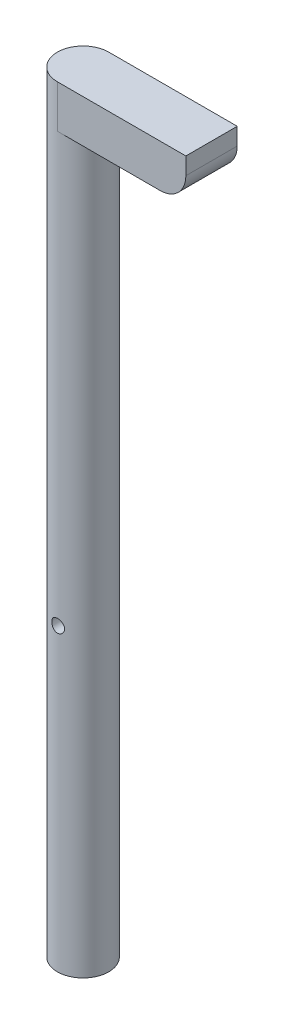
ISO-10303-21;
HEADER;
FILE_DESCRIPTION(('STEP AP214'),'2;1');
FILE_NAME('part.step','',(''),(''),'','','');
FILE_SCHEMA(('AUTOMOTIVE_DESIGN { 1 0 10303 214 1 1 1 1 }'));
ENDSEC;
DATA;
#1=APPLICATION_CONTEXT('core data for automotive mechanical design processes');
#2=APPLICATION_PROTOCOL_DEFINITION('international standard','automotive_design',2000,#1);
#3=PRODUCT_CONTEXT('',#1,'mechanical');
#4=PRODUCT('Part','Part','',(#3));
#5=PRODUCT_RELATED_PRODUCT_CATEGORY('part','',(#4));
#6=PRODUCT_DEFINITION_FORMATION('','',#4);
#7=PRODUCT_DEFINITION_CONTEXT('part definition',#1,'design');
#8=PRODUCT_DEFINITION('design','',#6,#7);
#9=PRODUCT_DEFINITION_SHAPE('','',#8);
#10=(LENGTH_UNIT() NAMED_UNIT(*) SI_UNIT(.MILLI.,.METRE.));
#11=(NAMED_UNIT(*) PLANE_ANGLE_UNIT() SI_UNIT($,.RADIAN.));
#12=(NAMED_UNIT(*) SI_UNIT($,.STERADIAN.) SOLID_ANGLE_UNIT());
#13=UNCERTAINTY_MEASURE_WITH_UNIT(LENGTH_MEASURE(1.E-05),#10,'distance_accuracy_value','');
#14=(GEOMETRIC_REPRESENTATION_CONTEXT(3) GLOBAL_UNCERTAINTY_ASSIGNED_CONTEXT((#13)) GLOBAL_UNIT_ASSIGNED_CONTEXT((#10,
#11,#12)) REPRESENTATION_CONTEXT('',''));
#15=CARTESIAN_POINT('',(0.,0.,0.));
#16=DIRECTION('',(0.,0.,1.));
#17=DIRECTION('',(1.,0.,0.));
#18=AXIS2_PLACEMENT_3D('',#15,#16,#17);
#19=CARTESIAN_POINT('',(12.,-2.,0.));
#20=DIRECTION('',(0.,0.,-1.));
#21=DIRECTION('',(-1.,0.,0.));
#22=AXIS2_PLACEMENT_3D('',#19,#20,#21);
#23=CYLINDRICAL_SURFACE('',#22,3.);
#24=DIRECTION('',(0.,0.,1.));
#25=VECTOR('',#24,1.);
#26=CARTESIAN_POINT('',(12.,-5.,0.));
#27=LINE('',#26,#25);
#28=CARTESIAN_POINT('',(12.,-5.,-3.));
#29=VERTEX_POINT('',#28);
#30=CARTESIAN_POINT('',(12.,-5.,3.));
#31=VERTEX_POINT('',#30);
#32=EDGE_CURVE('E100',#29,#31,#27,.T.);
#33=ORIENTED_EDGE('',*,*,#32,.F.);
#34=CARTESIAN_POINT('',(12.,-2.,-3.));
#35=DIRECTION('',(0.,0.,-1.));
#36=DIRECTION('',(-1.,0.,0.));
#37=AXIS2_PLACEMENT_3D('',#34,#35,#36);
#38=CIRCLE('',#37,3.);
#39=CARTESIAN_POINT('',(15.,-2.,-3.));
#40=VERTEX_POINT('',#39);
#41=EDGE_CURVE('E50',#40,#29,#38,.T.);
#42=ORIENTED_EDGE('',*,*,#41,.F.);
#43=DIRECTION('',(0.,0.,1.));
#44=VECTOR('',#43,1.);
#45=CARTESIAN_POINT('',(15.,-2.,0.));
#46=LINE('',#45,#44);
#47=CARTESIAN_POINT('',(15.,-2.,3.));
#48=VERTEX_POINT('',#47);
#49=EDGE_CURVE('E108',#48,#40,#46,.F.);
#50=ORIENTED_EDGE('',*,*,#49,.F.);
#51=CARTESIAN_POINT('',(12.,-2.,3.));
#52=DIRECTION('',(0.,0.,1.));
#53=DIRECTION('',(1.,0.,0.));
#54=AXIS2_PLACEMENT_3D('',#51,#52,#53);
#55=CIRCLE('',#54,3.);
#56=EDGE_CURVE('E58',#31,#48,#55,.T.);
#57=ORIENTED_EDGE('',*,*,#56,.F.);
#58=EDGE_LOOP('',(#33,#42,#50,#57));
#59=FACE_BOUND('',#58,.T.);
#60=ADVANCED_FACE('F33',(#59),#23,.T.);
#61=CARTESIAN_POINT('',(0.,-90.,0.));
#62=DIRECTION('',(0.,1.,0.));
#63=DIRECTION('',(0.,0.,1.));
#64=AXIS2_PLACEMENT_3D('',#61,#62,#63);
#65=CYLINDRICAL_SURFACE('',#64,3.);
#66=CARTESIAN_POINT('',(0.,-54.25,-3.));
#67=CARTESIAN_POINT('',(0.0414380443348654,-54.2500011628691,-2.99999929934007));
#68=CARTESIAN_POINT('',(0.0828890789153816,-54.2534457753869,-2.99913289065914));
#69=CARTESIAN_POINT('',(0.164603161885266,-54.2671125756535,-2.99576056914946));
#70=CARTESIAN_POINT('',(0.204865523435369,-54.2773386047689,-2.99325372709984));
#71=CARTESIAN_POINT('',(0.283010436091288,-54.304219626731,-2.9868781316602));
#72=CARTESIAN_POINT('',(0.320895781715001,-54.3208668993576,-2.98301101421043));
#73=CARTESIAN_POINT('',(0.393336065952213,-54.3600906950224,-2.97432671903797));
#74=CARTESIAN_POINT('',(0.42789089217438,-54.3826674180595,-2.96950950927025));
#75=CARTESIAN_POINT('',(0.49340096365046,-54.4336003948271,-2.95933706795901));
#76=CARTESIAN_POINT('',(0.524277845030536,-54.4620557874796,-2.95397353574266));
#77=CARTESIAN_POINT('',(0.580874463601653,-54.5237261024544,-2.94336810058765));
#78=CARTESIAN_POINT('',(0.606593618474569,-54.5569415614732,-2.93812621144174));
#79=CARTESIAN_POINT('',(0.652513271399517,-54.6277976133687,-2.92827387849855));
#80=CARTESIAN_POINT('',(0.672626107962679,-54.6654966154052,-2.92367397235303));
#81=CARTESIAN_POINT('',(0.706198454275266,-54.7438742058292,-2.91574747406112));
#82=CARTESIAN_POINT('',(0.71965902771967,-54.7845523166629,-2.91242067836394));
#83=CARTESIAN_POINT('',(0.739277418402151,-54.8668717491012,-2.90750238358775));
#84=CARTESIAN_POINT('',(0.745576134166675,-54.9084774480249,-2.90587745537713));
#85=CARTESIAN_POINT('',(0.751130887533933,-54.992184284507,-2.9044468126887));
#86=CARTESIAN_POINT('',(0.750388070908997,-55.0342853403493,-2.90464080224322));
#87=CARTESIAN_POINT('',(0.74199326231965,-55.1167079038722,-2.90679602748309));
#88=CARTESIAN_POINT('',(0.734509170095271,-55.1570478107325,-2.90871431500939));
#89=CARTESIAN_POINT('',(0.713112093451565,-55.2358805254556,-2.91403354838241));
#90=CARTESIAN_POINT('',(0.699198651034724,-55.2743732015145,-2.91743459985348));
#91=CARTESIAN_POINT('',(0.66519473896859,-55.348869008126,-2.92537556952093));
#92=CARTESIAN_POINT('',(0.64504333361647,-55.3848430858948,-2.9299266373471));
#93=CARTESIAN_POINT('',(0.599178138007491,-55.4529593548784,-2.93964855423193));
#94=CARTESIAN_POINT('',(0.573463374404432,-55.4851008740336,-2.94481951167367));
#95=CARTESIAN_POINT('',(0.516331712340621,-55.5456018078472,-2.9553794026989));
#96=CARTESIAN_POINT('',(0.484773129082944,-55.5738272450307,-2.96077034738986));
#97=CARTESIAN_POINT('',(0.417305958751865,-55.624610621232,-2.97102982789393));
#98=CARTESIAN_POINT('',(0.381397238853986,-55.6471683871318,-2.97589834774708));
#99=CARTESIAN_POINT('',(0.306057944340709,-55.6860252931122,-2.98458866047091));
#100=CARTESIAN_POINT('',(0.266615696604325,-55.7023026701272,-2.98840680063862));
#101=CARTESIAN_POINT('',(0.185438004071455,-55.7279586528548,-2.99453958495709));
#102=CARTESIAN_POINT('',(0.143702999575257,-55.7373385782091,-2.9968545166964));
#103=CARTESIAN_POINT('',(0.0602699851950282,-55.7487287827794,-2.99967749635687));
#104=CARTESIAN_POINT('',(0.0185983599941197,-55.7509215130376,-3.00023026754139));
#105=CARTESIAN_POINT('',(-0.0645164374007385,-55.7483754989723,-2.99959402407225));
#106=CARTESIAN_POINT('',(-0.105959629822281,-55.7436373786004,-2.99840516620923));
#107=CARTESIAN_POINT('',(-0.186807134388229,-55.7275145458043,-2.99444790563679));
#108=CARTESIAN_POINT('',(-0.226232559484361,-55.7162293682615,-2.99170317092906));
#109=CARTESIAN_POINT('',(-0.30262864622624,-55.6874464579858,-2.98494353317067));
#110=CARTESIAN_POINT('',(-0.339599059516301,-55.6699480978434,-2.98092850184946));
#111=CARTESIAN_POINT('',(-0.410761567214907,-55.6288819355626,-2.97196653963155));
#112=CARTESIAN_POINT('',(-0.444892720917899,-55.6052119438016,-2.96700433683466));
#113=CARTESIAN_POINT('',(-0.508763306821608,-55.5526050456015,-2.9567225459371));
#114=CARTESIAN_POINT('',(-0.538501979486489,-55.5236672301916,-2.95140289625853));
#115=CARTESIAN_POINT('',(-0.593495284036348,-55.4604990195778,-2.94084478480386));
#116=CARTESIAN_POINT('',(-0.618621933810997,-55.4261561484988,-2.93561152093641));
#117=CARTESIAN_POINT('',(-0.662755379506333,-55.3536336827672,-2.9259643918862));
#118=CARTESIAN_POINT('',(-0.681762447078957,-55.3154542585201,-2.92155049033513));
#119=CARTESIAN_POINT('',(-0.712975710304637,-55.2365471387935,-2.91409047367333));
#120=CARTESIAN_POINT('',(-0.725222198327022,-55.195836185828,-2.91103627645953));
#121=CARTESIAN_POINT('',(-0.74267282997688,-55.1128451810555,-2.90663372045092));
#122=CARTESIAN_POINT('',(-0.74787851373932,-55.0705654744838,-2.90528498859968));
#123=CARTESIAN_POINT('',(-0.751019295166991,-54.9869394880724,-2.90447450601979));
#124=CARTESIAN_POINT('',(-0.749158948890053,-54.9456012824376,-2.90495966364132));
#125=CARTESIAN_POINT('',(-0.738688639156429,-54.863848055666,-2.90763954503922));
#126=CARTESIAN_POINT('',(-0.73007881134338,-54.8234330159932,-2.90983423445928));
#127=CARTESIAN_POINT('',(-0.706465659721393,-54.7448957704673,-2.91565630341361));
#128=CARTESIAN_POINT('',(-0.691500702340184,-54.7067613473799,-2.91927507618155));
#129=CARTESIAN_POINT('',(-0.655632456802532,-54.6335173086432,-2.92753877862414));
#130=CARTESIAN_POINT('',(-0.634728345017092,-54.5984081134065,-2.93218385060387));
#131=CARTESIAN_POINT('',(-0.586933874318568,-54.531222685499,-2.94212817131756));
#132=CARTESIAN_POINT('',(-0.559901581456129,-54.499249463288,-2.94744132415879));
#133=CARTESIAN_POINT('',(-0.500894685594872,-54.4402264776023,-2.95804013623143));
#134=CARTESIAN_POINT('',(-0.468918910630577,-54.4131778849435,-2.9633257886353));
#135=CARTESIAN_POINT('',(-0.400233793351299,-54.3642943457177,-2.97338827823831));
#136=CARTESIAN_POINT('',(-0.363449211158198,-54.3425626931642,-2.97815416682934));
#137=CARTESIAN_POINT('',(-0.286633029755243,-54.3056262685297,-2.98652462487559));
#138=CARTESIAN_POINT('',(-0.246603781718375,-54.2904168196757,-2.99013002599891));
#139=CARTESIAN_POINT('',(-0.17220512662174,-54.2692140848352,-2.99524029782771));
#140=CARTESIAN_POINT('',(-0.138190085454038,-54.2620243784733,-2.99701292526345));
#141=CARTESIAN_POINT('',(-0.0694530357681436,-54.252417028189,-2.99939302615974));
#142=CARTESIAN_POINT('',(-0.0347310806213092,-54.2499990253473,-3.00000058725447));
#143=CARTESIAN_POINT('',(0.,-54.25,-3.));
#144=B_SPLINE_CURVE_WITH_KNOTS('',3,(#66,#67,#68,#69,#70,#71,#72,#73,#74,#75,#76,#77,#78,#79,
#80,#81,#82,#83,#84,#85,#86,#87,#88,#89,#90,#91,#92,#93,#94,#95,#96,#97,#98,#99,#100,#101,#102,
#103,#104,#105,#106,#107,#108,#109,#110,#111,#112,#113,#114,#115,#116,#117,#118,#119,#120,#121,
#122,#123,#124,#125,#126,#127,#128,#129,#130,#131,#132,#133,#134,#135,#136,#137,#138,#139,#140,
#141,#142,#143),.UNSPECIFIED.,.T.,.F.,(4,2,2,2,2,2,2,2,2,2,2,2,2,2,2,2,2,2,2,2,2,2,2,2,2,2,2,2,
2,2,2,2,2,2,2,2,2,2,4),(0.,0.124186856235944,0.248444118881949,0.372552451143052,
0.496664970084663,0.623072177185693,0.749493647900309,0.877793237729028,1.00607230584683,
1.13178147549715,1.25747019056348,1.38011248503508,1.50276351733019,1.6266526393694,
1.75056345418081,1.8780075048451,2.00545544779124,2.13334114504557,2.26120236844322,
2.38579154474638,2.51036950556371,2.63310137257018,2.75584563661145,2.88076793782675,
3.00571181504009,3.13372254602237,3.26172759374754,3.38896127307018,3.51616711626203,
3.63971890199306,3.76326820478018,3.88608200279723,4.00891284068451,4.13494788204954,
4.26101284885208,4.38936092749794,4.51761681910675,4.62171121471074,4.7257977802152),.UNSPECIFIED.);
#145=CARTESIAN_POINT('',(0.,-54.25,-3.));
#146=VERTEX_POINT('',#145);
#147=EDGE_CURVE('E11',#146,#146,#144,.T.);
#148=ORIENTED_EDGE('',*,*,#147,.F.);
#149=EDGE_LOOP('',(#148));
#150=FACE_BOUND('',#149,.T.);
#151=CARTESIAN_POINT('',(0.,-55.75,3.));
#152=CARTESIAN_POINT('',(0.0414380443348652,-55.7499988371309,2.99999929934006));
#153=CARTESIAN_POINT('',(0.0828890789153812,-55.7465542246131,2.99913289065914));
#154=CARTESIAN_POINT('',(0.164603161885266,-55.7328874243465,2.99576056914946));
#155=CARTESIAN_POINT('',(0.204865523435369,-55.7226613952311,2.99325372709984));
#156=CARTESIAN_POINT('',(0.283010436091288,-55.695780373269,2.9868781316602));
#157=CARTESIAN_POINT('',(0.320895781715001,-55.6791331006424,2.98301101421043));
#158=CARTESIAN_POINT('',(0.393336065952213,-55.6399093049776,2.97432671903797));
#159=CARTESIAN_POINT('',(0.427890892174379,-55.6173325819405,2.96950950927025));
#160=CARTESIAN_POINT('',(0.49340096365046,-55.5663996051729,2.95933706795901));
#161=CARTESIAN_POINT('',(0.524277845030536,-55.5379442125204,2.95397353574266));
#162=CARTESIAN_POINT('',(0.580874463601653,-55.4762738975456,2.94336810058765));
#163=CARTESIAN_POINT('',(0.606593618474569,-55.4430584385268,2.93812621144174));
#164=CARTESIAN_POINT('',(0.652513271399516,-55.3722023866313,2.92827387849855));
#165=CARTESIAN_POINT('',(0.672626107962677,-55.3345033845948,2.92367397235303));
#166=CARTESIAN_POINT('',(0.706198454275265,-55.2561257941708,2.91574747406112));
#167=CARTESIAN_POINT('',(0.719659027719669,-55.2154476833371,2.91242067836394));
#168=CARTESIAN_POINT('',(0.73927741840215,-55.1331282508988,2.90750238358775));
#169=CARTESIAN_POINT('',(0.745576134166674,-55.0915225519751,2.90587745537713));
#170=CARTESIAN_POINT('',(0.751130887533933,-55.007815715493,2.9044468126887));
#171=CARTESIAN_POINT('',(0.750388070908997,-54.9657146596507,2.90464080224322));
#172=CARTESIAN_POINT('',(0.74199326231965,-54.8832920961278,2.90679602748309));
#173=CARTESIAN_POINT('',(0.734509170095271,-54.8429521892675,2.90871431500939));
#174=CARTESIAN_POINT('',(0.713112093451565,-54.7641194745444,2.91403354838241));
#175=CARTESIAN_POINT('',(0.699198651034724,-54.7256267984855,2.91743459985348));
#176=CARTESIAN_POINT('',(0.66519473896859,-54.651130991874,2.92537556952093));
#177=CARTESIAN_POINT('',(0.64504333361647,-54.6151569141052,2.9299266373471));
#178=CARTESIAN_POINT('',(0.599178138007491,-54.5470406451216,2.93964855423193));
#179=CARTESIAN_POINT('',(0.573463374404432,-54.5148991259664,2.94481951167367));
#180=CARTESIAN_POINT('',(0.516331712340621,-54.4543981921528,2.9553794026989));
#181=CARTESIAN_POINT('',(0.484773129082944,-54.4261727549693,2.96077034738986));
#182=CARTESIAN_POINT('',(0.417305958751865,-54.375389378768,2.97102982789393));
#183=CARTESIAN_POINT('',(0.381397238853986,-54.3528316128682,2.97589834774708));
#184=CARTESIAN_POINT('',(0.30605794434071,-54.3139747068878,2.98458866047091));
#185=CARTESIAN_POINT('',(0.266615696604328,-54.2976973298728,2.98840680063862));
#186=CARTESIAN_POINT('',(0.185438004071459,-54.2720413471452,2.99453958495709));
#187=CARTESIAN_POINT('',(0.143702999575259,-54.2626614217909,2.9968545166964));
#188=CARTESIAN_POINT('',(0.0602699851950286,-54.2512712172206,2.99967749635687));
#189=CARTESIAN_POINT('',(0.0185983599941202,-54.2490784869624,3.00023026754139));
#190=CARTESIAN_POINT('',(-0.064516437400738,-54.2516245010277,2.99959402407225));
#191=CARTESIAN_POINT('',(-0.105959629822281,-54.2563626213996,2.99840516620923));
#192=CARTESIAN_POINT('',(-0.18680713438823,-54.2724854541957,2.99444790563679));
#193=CARTESIAN_POINT('',(-0.226232559484363,-54.2837706317385,2.99170317092906));
#194=CARTESIAN_POINT('',(-0.302628646226241,-54.3125535420142,2.98494353317067));
#195=CARTESIAN_POINT('',(-0.339599059516302,-54.3300519021566,2.98092850184946));
#196=CARTESIAN_POINT('',(-0.410761567214907,-54.3711180644374,2.97196653963155));
#197=CARTESIAN_POINT('',(-0.444892720917899,-54.3947880561984,2.96700433683466));
#198=CARTESIAN_POINT('',(-0.508763306821608,-54.4473949543985,2.9567225459371));
#199=CARTESIAN_POINT('',(-0.538501979486488,-54.4763327698084,2.95140289625853));
#200=CARTESIAN_POINT('',(-0.593495284036351,-54.5395009804222,2.94084478480386));
#201=CARTESIAN_POINT('',(-0.618621933811002,-54.5738438515012,2.93561152093641));
#202=CARTESIAN_POINT('',(-0.662755379506337,-54.6463663172328,2.9259643918862));
#203=CARTESIAN_POINT('',(-0.681762447078958,-54.6845457414799,2.92155049033513));
#204=CARTESIAN_POINT('',(-0.712975710304636,-54.7634528612065,2.91409047367333));
#205=CARTESIAN_POINT('',(-0.725222198327022,-54.804163814172,2.91103627645953));
#206=CARTESIAN_POINT('',(-0.74267282997688,-54.8871548189445,2.90663372045092));
#207=CARTESIAN_POINT('',(-0.74787851373932,-54.9294345255162,2.90528498859968));
#208=CARTESIAN_POINT('',(-0.751019295166991,-55.0130605119276,2.90447450601979));
#209=CARTESIAN_POINT('',(-0.749158948890053,-55.0543987175624,2.90495966364132));
#210=CARTESIAN_POINT('',(-0.738688639156429,-55.136151944334,2.90763954503921));
#211=CARTESIAN_POINT('',(-0.730078811343381,-55.1765669840068,2.90983423445928));
#212=CARTESIAN_POINT('',(-0.706465659721395,-55.2551042295327,2.91565630341361));
#213=CARTESIAN_POINT('',(-0.691500702340185,-55.2932386526201,2.91927507618155));
#214=CARTESIAN_POINT('',(-0.655632456802533,-55.3664826913568,2.92753877862414));
#215=CARTESIAN_POINT('',(-0.634728345017092,-55.4015918865935,2.93218385060387));
#216=CARTESIAN_POINT('',(-0.586933874318566,-55.468777314501,2.94212817131756));
#217=CARTESIAN_POINT('',(-0.559901581456125,-55.500750536712,2.94744132415879));
#218=CARTESIAN_POINT('',(-0.500894685594867,-55.5597735223977,2.95804013623143));
#219=CARTESIAN_POINT('',(-0.468918910630575,-55.5868221150565,2.9633257886353));
#220=CARTESIAN_POINT('',(-0.400233793351299,-55.6357056542823,2.97338827823831));
#221=CARTESIAN_POINT('',(-0.363449211158198,-55.6574373068358,2.97815416682934));
#222=CARTESIAN_POINT('',(-0.286633029755243,-55.6943737314703,2.98652462487559));
#223=CARTESIAN_POINT('',(-0.246603781718375,-55.7095831803243,2.99013002599891));
#224=CARTESIAN_POINT('',(-0.17220512662174,-55.7307859151648,2.99524029782771));
#225=CARTESIAN_POINT('',(-0.138190085454037,-55.7379756215267,2.99701292526345));
#226=CARTESIAN_POINT('',(-0.0694530357681431,-55.747582971811,2.99939302615974));
#227=CARTESIAN_POINT('',(-0.034731080621309,-55.7500009746527,3.00000058725447));
#228=CARTESIAN_POINT('',(0.,-55.75,3.));
#229=B_SPLINE_CURVE_WITH_KNOTS('',3,(#151,#152,#153,#154,#155,#156,#157,#158,#159,#160,#161,
#162,#163,#164,#165,#166,#167,#168,#169,#170,#171,#172,#173,#174,#175,#176,#177,#178,#179,#180,
#181,#182,#183,#184,#185,#186,#187,#188,#189,#190,#191,#192,#193,#194,#195,#196,#197,#198,#199,
#200,#201,#202,#203,#204,#205,#206,#207,#208,#209,#210,#211,#212,#213,#214,#215,#216,#217,#218,
#219,#220,#221,#222,#223,#224,#225,#226,#227,#228),.UNSPECIFIED.,.T.,.F.,(4,2,2,2,2,2,2,2,2,2,2,
2,2,2,2,2,2,2,2,2,2,2,2,2,2,2,2,2,2,2,2,2,2,2,2,2,2,2,4),(0.,0.124186856235945,0.24844411888195,
0.372552451143052,0.496664970084664,0.623072177185694,0.749493647900309,0.877793237729021,
1.00607230584684,1.13178147549714,1.25747019056348,1.38011248503508,1.50276351733019,
1.6266526393694,1.75056345418081,1.8780075048451,2.00545544779124,2.13334114504557,
2.26120236844322,2.38579154474638,2.51036950556371,2.63310137257019,2.75584563661145,
2.88076793782676,3.00571181504009,3.13372254602238,3.26172759374754,3.38896127307018,
3.51616711626204,3.63971890199306,3.76326820478017,3.88608200279724,4.00891284068451,
4.13494788204955,4.26101284885208,4.38936092749794,4.51761681910675,4.62171121471075,
4.7257977802152),.UNSPECIFIED.);
#230=CARTESIAN_POINT('',(0.,-55.75,3.));
#231=VERTEX_POINT('',#230);
#232=EDGE_CURVE('E43',#231,#231,#229,.T.);
#233=ORIENTED_EDGE('',*,*,#232,.F.);
#234=EDGE_LOOP('',(#233));
#235=FACE_BOUND('',#234,.T.);
#236=CARTESIAN_POINT('',(0.,-90.,0.));
#237=DIRECTION('',(0.,1.,0.));
#238=DIRECTION('',(0.,0.,1.));
#239=AXIS2_PLACEMENT_3D('',#236,#237,#238);
#240=CIRCLE('',#239,3.);
#241=CARTESIAN_POINT('',(0.,-90.,3.));
#242=VERTEX_POINT('',#241);
#243=EDGE_CURVE('E106',#242,#242,#240,.T.);
#244=ORIENTED_EDGE('',*,*,#243,.T.);
#245=EDGE_LOOP('',(#244));
#246=FACE_BOUND('',#245,.T.);
#247=CARTESIAN_POINT('',(0.,0.,0.));
#248=DIRECTION('',(0.,1.,0.));
#249=DIRECTION('',(0.,0.,1.));
#250=AXIS2_PLACEMENT_3D('',#247,#248,#249);
#251=CIRCLE('',#250,3.);
#252=CARTESIAN_POINT('',(0.,0.,-3.));
#253=VERTEX_POINT('',#252);
#254=CARTESIAN_POINT('',(0.,0.,3.));
#255=VERTEX_POINT('',#254);
#256=EDGE_CURVE('E111',#253,#255,#251,.T.);
#257=ORIENTED_EDGE('',*,*,#256,.F.);
#258=DIRECTION('',(0.,1.,0.));
#259=VECTOR('',#258,1.);
#260=CARTESIAN_POINT('',(0.,-5.,-3.));
#261=LINE('',#260,#259);
#262=CARTESIAN_POINT('',(0.,-5.,-3.));
#263=VERTEX_POINT('',#262);
#264=EDGE_CURVE('E105',#263,#253,#261,.T.);
#265=ORIENTED_EDGE('',*,*,#264,.F.);
#266=CARTESIAN_POINT('',(0.,-5.,0.));
#267=DIRECTION('',(0.,1.,0.));
#268=DIRECTION('',(0.,0.,1.));
#269=AXIS2_PLACEMENT_3D('',#266,#267,#268);
#270=CIRCLE('',#269,3.);
#271=CARTESIAN_POINT('',(0.,-5.,3.));
#272=VERTEX_POINT('',#271);
#273=EDGE_CURVE('E98',#263,#272,#270,.F.);
#274=ORIENTED_EDGE('',*,*,#273,.T.);
#275=DIRECTION('',(0.,1.,0.));
#276=VECTOR('',#275,1.);
#277=CARTESIAN_POINT('',(0.,-5.,3.));
#278=LINE('',#277,#276);
#279=EDGE_CURVE('E80',#272,#255,#278,.T.);
#280=ORIENTED_EDGE('',*,*,#279,.T.);
#281=EDGE_LOOP('',(#257,#265,#274,#280));
#282=FACE_BOUND('',#281,.T.);
#283=ADVANCED_FACE('F103',(#150,#235,#246,#282),#65,.T.);
#284=CARTESIAN_POINT('',(0.,-90.,0.));
#285=DIRECTION('',(0.,1.,0.));
#286=DIRECTION('',(0.,0.,1.));
#287=AXIS2_PLACEMENT_3D('',#284,#285,#286);
#288=PLANE('',#287);
#289=ORIENTED_EDGE('',*,*,#243,.F.);
#290=EDGE_LOOP('',(#289));
#291=FACE_BOUND('',#290,.T.);
#292=ADVANCED_FACE('F141',(#291),#288,.F.);
#293=CARTESIAN_POINT('',(0.,0.,0.));
#294=DIRECTION('',(0.,1.,0.));
#295=DIRECTION('',(0.,0.,1.));
#296=AXIS2_PLACEMENT_3D('',#293,#294,#295);
#297=PLANE('',#296);
#298=ORIENTED_EDGE('',*,*,#256,.T.);
#299=DIRECTION('',(1.,0.,0.));
#300=VECTOR('',#299,1.);
#301=CARTESIAN_POINT('',(15.,0.,3.));
#302=LINE('',#301,#300);
#303=CARTESIAN_POINT('',(15.,0.,3.));
#304=VERTEX_POINT('',#303);
#305=EDGE_CURVE('E85',#255,#304,#302,.T.);
#306=ORIENTED_EDGE('',*,*,#305,.T.);
#307=DIRECTION('',(0.,0.,-1.));
#308=VECTOR('',#307,1.);
#309=CARTESIAN_POINT('',(15.,0.,-3.));
#310=LINE('',#309,#308);
#311=CARTESIAN_POINT('',(15.,0.,-3.));
#312=VERTEX_POINT('',#311);
#313=EDGE_CURVE('E156',#304,#312,#310,.T.);
#314=ORIENTED_EDGE('',*,*,#313,.T.);
#315=DIRECTION('',(-1.,0.,0.));
#316=VECTOR('',#315,1.);
#317=CARTESIAN_POINT('',(15.,0.,-3.));
#318=LINE('',#317,#316);
#319=EDGE_CURVE('E101',#312,#253,#318,.T.);
#320=ORIENTED_EDGE('',*,*,#319,.T.);
#321=EDGE_LOOP('',(#298,#306,#314,#320));
#322=FACE_BOUND('',#321,.T.);
#323=ADVANCED_FACE('F134',(#322),#297,.T.);
#324=CARTESIAN_POINT('',(15.,-5.,-3.));
#325=DIRECTION('',(0.,0.,-1.));
#326=DIRECTION('',(-1.,0.,0.));
#327=AXIS2_PLACEMENT_3D('',#324,#325,#326);
#328=PLANE('',#327);
#329=DIRECTION('',(0.,1.,0.));
#330=VECTOR('',#329,1.);
#331=CARTESIAN_POINT('',(15.,-5.,-3.));
#332=LINE('',#331,#330);
#333=EDGE_CURVE('E161',#40,#312,#332,.T.);
#334=ORIENTED_EDGE('',*,*,#333,.F.);
#335=ORIENTED_EDGE('',*,*,#41,.T.);
#336=DIRECTION('',(-1.,0.,0.));
#337=VECTOR('',#336,1.);
#338=CARTESIAN_POINT('',(15.,-5.,-3.));
#339=LINE('',#338,#337);
#340=EDGE_CURVE('E91',#29,#263,#339,.T.);
#341=ORIENTED_EDGE('',*,*,#340,.T.);
#342=ORIENTED_EDGE('',*,*,#264,.T.);
#343=ORIENTED_EDGE('',*,*,#319,.F.);
#344=EDGE_LOOP('',(#334,#335,#341,#342,#343));
#345=FACE_BOUND('',#344,.T.);
#346=ADVANCED_FACE('F130',(#345),#328,.T.);
#347=CARTESIAN_POINT('',(15.,-5.,-3.));
#348=DIRECTION('',(1.,0.,0.));
#349=DIRECTION('',(0.,0.,-1.));
#350=AXIS2_PLACEMENT_3D('',#347,#348,#349);
#351=PLANE('',#350);
#352=DIRECTION('',(0.,1.,0.));
#353=VECTOR('',#352,1.);
#354=CARTESIAN_POINT('',(15.,-5.,3.));
#355=LINE('',#354,#353);
#356=EDGE_CURVE('E90',#48,#304,#355,.T.);
#357=ORIENTED_EDGE('',*,*,#356,.F.);
#358=ORIENTED_EDGE('',*,*,#49,.T.);
#359=ORIENTED_EDGE('',*,*,#333,.T.);
#360=ORIENTED_EDGE('',*,*,#313,.F.);
#361=EDGE_LOOP('',(#357,#358,#359,#360));
#362=FACE_BOUND('',#361,.T.);
#363=ADVANCED_FACE('F133',(#362),#351,.T.);
#364=CARTESIAN_POINT('',(15.,-5.,3.));
#365=DIRECTION('',(0.,0.,1.));
#366=DIRECTION('',(1.,0.,0.));
#367=AXIS2_PLACEMENT_3D('',#364,#365,#366);
#368=PLANE('',#367);
#369=DIRECTION('',(1.,0.,0.));
#370=VECTOR('',#369,1.);
#371=CARTESIAN_POINT('',(15.,-5.,3.));
#372=LINE('',#371,#370);
#373=EDGE_CURVE('E83',#272,#31,#372,.T.);
#374=ORIENTED_EDGE('',*,*,#373,.T.);
#375=ORIENTED_EDGE('',*,*,#56,.T.);
#376=ORIENTED_EDGE('',*,*,#356,.T.);
#377=ORIENTED_EDGE('',*,*,#305,.F.);
#378=ORIENTED_EDGE('',*,*,#279,.F.);
#379=EDGE_LOOP('',(#374,#375,#376,#377,#378));
#380=FACE_BOUND('',#379,.T.);
#381=ADVANCED_FACE('F82',(#380),#368,.T.);
#382=CARTESIAN_POINT('',(0.,-5.,0.));
#383=DIRECTION('',(0.,1.,0.));
#384=DIRECTION('',(0.,0.,1.));
#385=AXIS2_PLACEMENT_3D('',#382,#383,#384);
#386=PLANE('',#385);
#387=ORIENTED_EDGE('',*,*,#340,.F.);
#388=ORIENTED_EDGE('',*,*,#32,.T.);
#389=ORIENTED_EDGE('',*,*,#373,.F.);
#390=ORIENTED_EDGE('',*,*,#273,.F.);
#391=EDGE_LOOP('',(#387,#388,#389,#390));
#392=FACE_BOUND('',#391,.T.);
#393=ADVANCED_FACE('F97',(#392),#386,.F.);
#394=CARTESIAN_POINT('',(0.,-55.,-3.));
#395=DIRECTION('',(0.,0.,1.));
#396=DIRECTION('',(1.,0.,0.));
#397=AXIS2_PLACEMENT_3D('',#394,#395,#396);
#398=CYLINDRICAL_SURFACE('',#397,0.75);
#399=ORIENTED_EDGE('',*,*,#232,.T.);
#400=EDGE_LOOP('',(#399));
#401=FACE_BOUND('',#400,.T.);
#402=ORIENTED_EDGE('',*,*,#147,.T.);
#403=EDGE_LOOP('',(#402));
#404=FACE_BOUND('',#403,.T.);
#405=ADVANCED_FACE('F122',(#401,#404),#398,.F.);
#406=CLOSED_SHELL('',(#60,#283,#292,#323,#346,#363,#381,#393,#405));
#407=MANIFOLD_SOLID_BREP('B2',#406);
#408=ADVANCED_BREP_SHAPE_REPRESENTATION('',(#18,#407),#14);
#409=SHAPE_DEFINITION_REPRESENTATION(#9,#408);
ENDSEC;
END-ISO-10303-21;
